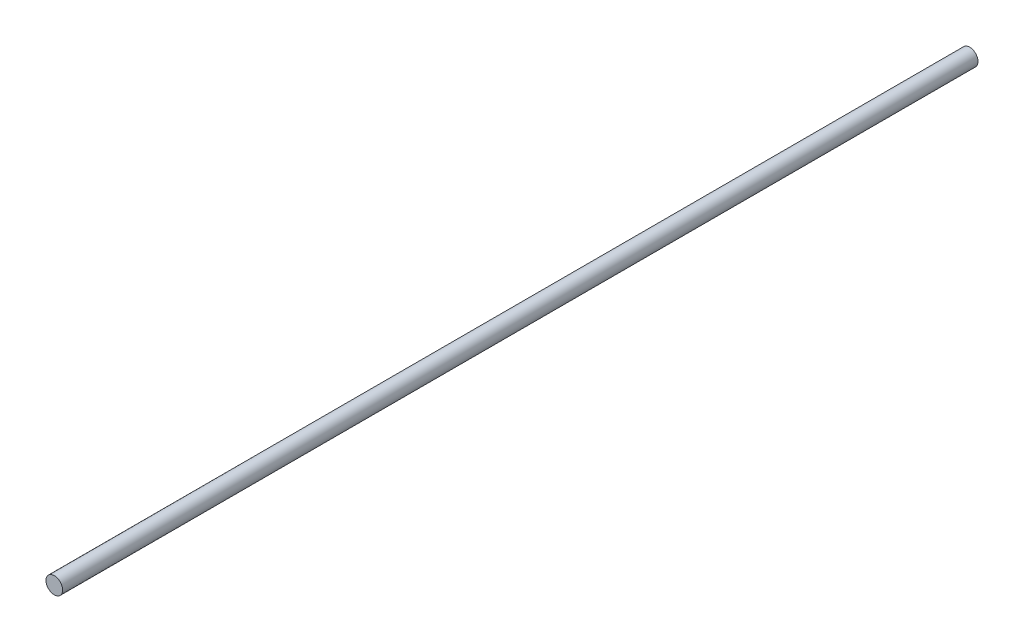
ISO-10303-21;
HEADER;
FILE_DESCRIPTION(('STEP AP214'),'2;1');
FILE_NAME('part.step','',(''),(''),'','','');
FILE_SCHEMA(('AUTOMOTIVE_DESIGN { 1 0 10303 214 1 1 1 1 }'));
ENDSEC;
DATA;
#1=APPLICATION_CONTEXT('core data for automotive mechanical design processes');
#2=APPLICATION_PROTOCOL_DEFINITION('international standard','automotive_design',2000,#1);
#3=PRODUCT_CONTEXT('',#1,'mechanical');
#4=PRODUCT('Part','Part','',(#3));
#5=PRODUCT_RELATED_PRODUCT_CATEGORY('part','',(#4));
#6=PRODUCT_DEFINITION_FORMATION('','',#4);
#7=PRODUCT_DEFINITION_CONTEXT('part definition',#1,'design');
#8=PRODUCT_DEFINITION('design','',#6,#7);
#9=PRODUCT_DEFINITION_SHAPE('','',#8);
#10=(LENGTH_UNIT() NAMED_UNIT(*) SI_UNIT(.MILLI.,.METRE.));
#11=(NAMED_UNIT(*) PLANE_ANGLE_UNIT() SI_UNIT($,.RADIAN.));
#12=(NAMED_UNIT(*) SI_UNIT($,.STERADIAN.) SOLID_ANGLE_UNIT());
#13=UNCERTAINTY_MEASURE_WITH_UNIT(LENGTH_MEASURE(1.E-05),#10,'distance_accuracy_value','');
#14=(GEOMETRIC_REPRESENTATION_CONTEXT(3) GLOBAL_UNCERTAINTY_ASSIGNED_CONTEXT((#13)) GLOBAL_UNIT_ASSIGNED_CONTEXT((#10,
#11,#12)) REPRESENTATION_CONTEXT('',''));
#15=CARTESIAN_POINT('',(0.,0.,0.));
#16=DIRECTION('',(0.,0.,1.));
#17=DIRECTION('',(1.,0.,0.));
#18=AXIS2_PLACEMENT_3D('',#15,#16,#17);
#19=CARTESIAN_POINT('',(0.,0.,880.));
#20=DIRECTION('',(0.,0.,-1.));
#21=DIRECTION('',(-1.,0.,0.));
#22=AXIS2_PLACEMENT_3D('',#19,#20,#21);
#23=CYLINDRICAL_SURFACE('',#22,8.);
#24=CARTESIAN_POINT('',(0.,0.,880.));
#25=DIRECTION('',(0.,0.,1.));
#26=DIRECTION('',(1.,0.,0.));
#27=AXIS2_PLACEMENT_3D('',#24,#25,#26);
#28=CIRCLE('',#27,8.);
#29=CARTESIAN_POINT('',(8.,0.,880.));
#30=VERTEX_POINT('',#29);
#31=EDGE_CURVE('E93',#30,#30,#28,.T.);
#32=ORIENTED_EDGE('',*,*,#31,.F.);
#33=EDGE_LOOP('',(#32));
#34=FACE_BOUND('',#33,.T.);
#35=CARTESIAN_POINT('',(0.,0.,0.));
#36=DIRECTION('',(0.,0.,1.));
#37=DIRECTION('',(1.,0.,0.));
#38=AXIS2_PLACEMENT_3D('',#35,#36,#37);
#39=CIRCLE('',#38,8.);
#40=CARTESIAN_POINT('',(8.,0.,0.));
#41=VERTEX_POINT('',#40);
#42=EDGE_CURVE('E94',#41,#41,#39,.T.);
#43=ORIENTED_EDGE('',*,*,#42,.T.);
#44=EDGE_LOOP('',(#43));
#45=FACE_BOUND('',#44,.T.);
#46=CARTESIAN_POINT('',(0.,-8.,97.9));
#47=CARTESIAN_POINT('',(0.115833511596032,-7.99999819195628,97.9000028841035));
#48=CARTESIAN_POINT('',(0.2316982501951,-7.99745940051544,97.909616018956));
#49=CARTESIAN_POINT('',(0.460094342166995,-7.98757807310896,97.9477491888625));
#50=CARTESIAN_POINT('',(0.57262398898168,-7.98023312073598,97.9762787346706));
#51=CARTESIAN_POINT('',(0.791019725256029,-7.96155083904336,98.0512565592851));
#52=CARTESIAN_POINT('',(0.896894059814115,-7.95021856917511,98.0976821371673));
#53=CARTESIAN_POINT('',(1.09935331899362,-7.92476163254481,98.2070511061223));
#54=CARTESIAN_POINT('',(1.19593770097294,-7.9106368028116,98.2699954612855));
#55=CARTESIAN_POINT('',(1.37925117233376,-7.88076611628938,98.4121124904898));
#56=CARTESIAN_POINT('',(1.4657411616673,-7.86499323150058,98.491587902084));
#57=CARTESIAN_POINT('',(1.62433067101484,-7.83377920697858,98.6638636153888));
#58=CARTESIAN_POINT('',(1.69642839863793,-7.81833810877902,98.7566655742965));
#59=CARTESIAN_POINT('',(1.82534201984977,-7.78926051431185,98.9548552889287));
#60=CARTESIAN_POINT('',(1.88188479269613,-7.77565817367775,99.0604261677836));
#61=CARTESIAN_POINT('',(1.97632500272312,-7.75219477487355,99.2799903974762));
#62=CARTESIAN_POINT('',(2.01422575983108,-7.7423330506146,99.3939822444749));
#63=CARTESIAN_POINT('',(2.06947944147047,-7.7277461952108,99.6245093400241));
#64=CARTESIAN_POINT('',(2.08726496052538,-7.72291310952526,99.7409339071786));
#65=CARTESIAN_POINT('',(2.10313167360473,-7.71860806057403,99.9752068838476));
#66=CARTESIAN_POINT('',(2.10121642629329,-7.71913512907228,100.093055032371));
#67=CARTESIAN_POINT('',(2.0780798464493,-7.72539410663991,100.323469123258));
#68=CARTESIAN_POINT('',(2.0573799110671,-7.73098544141679,100.436091843791));
#69=CARTESIAN_POINT('',(1.99809578012526,-7.74651813456766,100.656207070715));
#70=CARTESIAN_POINT('',(1.95951019476546,-7.7564598309821,100.763699177718));
#71=CARTESIAN_POINT('',(1.86512025732493,-7.77969805661573,100.97187090562));
#72=CARTESIAN_POINT('',(1.80913147739731,-7.7930302267118,101.072462756221));
#73=CARTESIAN_POINT('',(1.68165320895311,-7.82152779691157,101.263007705067));
#74=CARTESIAN_POINT('',(1.61016075495162,-7.8366935474898,101.352958762886));
#75=CARTESIAN_POINT('',(1.45102969385664,-7.86773635205478,101.522650029283));
#76=CARTESIAN_POINT('',(1.36295268682581,-7.88362074841378,101.601978339697));
#77=CARTESIAN_POINT('',(1.17455235148027,-7.9138812117581,101.744821352634));
#78=CARTESIAN_POINT('',(1.0742285698877,-7.92825722287841,101.808335469577));
#79=CARTESIAN_POINT('',(0.863557488892556,-7.9539650793444,101.917920747267));
#80=CARTESIAN_POINT('',(0.753170779424595,-7.96528420192041,101.963919324056));
#81=CARTESIAN_POINT('',(0.52586665924305,-7.98351083849399,102.03658854789));
#82=CARTESIAN_POINT('',(0.408950635574086,-7.99041928561896,102.063263283269));
#83=CARTESIAN_POINT('',(0.175423559502846,-7.99890583282364,102.095885420056));
#84=CARTESIAN_POINT('',(0.0588958853132472,-8.00062796836815,102.102393059625));
#85=CARTESIAN_POINT('',(-0.173585198681033,-7.99896097516747,102.096040739059));
#86=CARTESIAN_POINT('',(-0.289538664704997,-7.995572357143,102.083182714145));
#87=CARTESIAN_POINT('',(-0.515593754541121,-7.984157457251,102.038924190964));
#88=CARTESIAN_POINT('',(-0.625760501734723,-7.97620894030456,102.00783442566));
#89=CARTESIAN_POINT('',(-0.839305551591581,-7.95657428999088,101.928354271575));
#90=CARTESIAN_POINT('',(-0.942683129198787,-7.94488775819851,101.879962038505));
#91=CARTESIAN_POINT('',(-1.14190556423421,-7.91873395907708,101.766199606419));
#92=CARTESIAN_POINT('',(-1.23756848708351,-7.90421777265738,101.70052232588));
#93=CARTESIAN_POINT('',(-1.41671266217741,-7.87408351702661,101.554441818707));
#94=CARTESIAN_POINT('',(-1.5001915802279,-7.85846523752612,101.474035776996));
#95=CARTESIAN_POINT('',(-1.65494567981238,-7.82736002069367,101.298168872151));
#96=CARTESIAN_POINT('',(-1.72582613334943,-7.81188827100348,101.202357351983));
#97=CARTESIAN_POINT('',(-1.8505091432143,-7.78329771683265,100.999874695246));
#98=CARTESIAN_POINT('',(-1.90431242793833,-7.77017881200599,100.893204022109));
#99=CARTESIAN_POINT('',(-1.99290882876436,-7.74792888141172,100.672575981125));
#100=CARTESIAN_POINT('',(-2.02781305294318,-7.7387746125757,100.558665700038));
#101=CARTESIAN_POINT('',(-2.07789189088264,-7.72548052331326,100.326312784399));
#102=CARTESIAN_POINT('',(-2.09307135708221,-7.72133946961532,100.207871271948));
#103=CARTESIAN_POINT('',(-2.10299708758535,-7.71864141974656,99.973852831068));
#104=CARTESIAN_POINT('',(-2.09837684761733,-7.71991129232351,99.8583043589288));
#105=CARTESIAN_POINT('',(-2.07029878979463,-7.72748795420559,99.6296961976146));
#106=CARTESIAN_POINT('',(-2.04684142851754,-7.73379462142794,99.5166364481857));
#107=CARTESIAN_POINT('',(-1.98211695965678,-7.75063286395604,99.2969846342805));
#108=CARTESIAN_POINT('',(-1.94098015209595,-7.76113348993467,99.1903516360554));
#109=CARTESIAN_POINT('',(-1.84216607539681,-7.78517811860663,98.9854212336498));
#110=CARTESIAN_POINT('',(-1.78448628618962,-7.79872258491415,98.8871251024212));
#111=CARTESIAN_POINT('',(-1.6522867719803,-7.82781234314863,98.6986252324231));
#112=CARTESIAN_POINT('',(-1.5773328769132,-7.84340375519353,98.6087330626012));
#113=CARTESIAN_POINT('',(-1.41354374950194,-7.87456866492059,98.4425965579096));
#114=CARTESIAN_POINT('',(-1.3247051685619,-7.89014215736594,98.3663555248523));
#115=CARTESIAN_POINT('',(-1.1334670690893,-7.91989872252632,98.2281496584028));
#116=CARTESIAN_POINT('',(-1.03082655013164,-7.9340466781842,98.166510116505));
#117=CARTESIAN_POINT('',(-0.816273578266164,-7.95897761465417,98.0614584496492));
#118=CARTESIAN_POINT('',(-0.704367313251969,-7.96976281861927,98.0180342757192));
#119=CARTESIAN_POINT('',(-0.494016221616854,-7.98530690779944,97.9565111956749));
#120=CARTESIAN_POINT('',(-0.396503425400239,-7.99077726156327,97.9353678295777));
#121=CARTESIAN_POINT('',(-0.199334661752044,-7.99812441974496,97.9071116383897));
#122=CARTESIAN_POINT('',(-0.0996788930174474,-8.00000155588649,97.8999975181255));
#123=CARTESIAN_POINT('',(0.,-8.,97.9));
#124=B_SPLINE_CURVE_WITH_KNOTS('',3,(#46,#47,#48,#49,#50,#51,#52,#53,#54,#55,#56,#57,#58,#59,
#60,#61,#62,#63,#64,#65,#66,#67,#68,#69,#70,#71,#72,#73,#74,#75,#76,#77,#78,#79,#80,#81,#82,#83,
#84,#85,#86,#87,#88,#89,#90,#91,#92,#93,#94,#95,#96,#97,#98,#99,#100,#101,#102,#103,#104,#105,
#106,#107,#108,#109,#110,#111,#112,#113,#114,#115,#116,#117,#118,#119,#120,#121,#122,#123),
.UNSPECIFIED.,.T.,.F.,(4,2,2,2,2,2,2,2,2,2,2,2,2,2,2,2,2,2,2,2,2,2,2,2,2,2,2,2,2,2,2,2,2,2,2,2,
2,2,4),(0.,0.347135054104694,0.694444772537975,1.04131537442452,1.38820622533059,
1.74211971953539,2.09607726214146,2.45590198930199,2.81566261261907,3.16752972358662,
3.51933327586563,3.8616610312913,4.20401539167376,4.55012917269264,4.89630921554974,
5.25341577873974,5.61053556317449,5.96911954203014,6.32762763330046,6.6760828500082,
7.02450324768105,7.3671511676382,7.70983562170948,8.05907568618484,8.40838256999331,
8.76721198310333,9.12602608892656,9.48270715827049,9.83930046476419,10.1845711385303,
10.5298334438156,10.8725936173096,11.2154060328041,11.5680159891063,11.9207111166158,
12.2806484321439,12.6403472820153,12.9390970335523,13.2378192033626),.UNSPECIFIED.);
#125=CARTESIAN_POINT('',(0.,-8.,97.9));
#126=VERTEX_POINT('',#125);
#127=EDGE_CURVE('E88',#126,#126,#124,.T.);
#128=ORIENTED_EDGE('',*,*,#127,.F.);
#129=EDGE_LOOP('',(#128));
#130=FACE_BOUND('',#129,.T.);
#131=CARTESIAN_POINT('',(0.,-8.,247.9));
#132=CARTESIAN_POINT('',(0.115833511596035,-7.99999819195628,247.900002884103));
#133=CARTESIAN_POINT('',(0.231698250195107,-7.99745940051544,247.909616018956));
#134=CARTESIAN_POINT('',(0.460094342167,-7.98757807310896,247.947749188862));
#135=CARTESIAN_POINT('',(0.572623988981681,-7.98023312073598,247.976278734671));
#136=CARTESIAN_POINT('',(0.791019725256028,-7.96155083904337,248.051256559285));
#137=CARTESIAN_POINT('',(0.896894059814116,-7.95021856917511,248.097682137167));
#138=CARTESIAN_POINT('',(1.09935331899363,-7.92476163254481,248.207051106122));
#139=CARTESIAN_POINT('',(1.19593770097295,-7.9106368028116,248.269995461285));
#140=CARTESIAN_POINT('',(1.37925117233377,-7.88076611628938,248.41211249049));
#141=CARTESIAN_POINT('',(1.46574116166732,-7.86499323150058,248.491587902084));
#142=CARTESIAN_POINT('',(1.62433067101486,-7.83377920697858,248.663863615389));
#143=CARTESIAN_POINT('',(1.69642839863794,-7.81833810877902,248.756665574296));
#144=CARTESIAN_POINT('',(1.82534201984978,-7.78926051431185,248.954855288929));
#145=CARTESIAN_POINT('',(1.88188479269615,-7.77565817367774,249.060426167784));
#146=CARTESIAN_POINT('',(1.97632500272314,-7.75219477487355,249.279990397476));
#147=CARTESIAN_POINT('',(2.01422575983108,-7.7423330506146,249.393982244475));
#148=CARTESIAN_POINT('',(2.06947944147047,-7.7277461952108,249.624509340024));
#149=CARTESIAN_POINT('',(2.08726496052538,-7.72291310952526,249.740933907179));
#150=CARTESIAN_POINT('',(2.10313167360473,-7.71860806057403,249.975206883848));
#151=CARTESIAN_POINT('',(2.10121642629329,-7.71913512907228,250.093055032371));
#152=CARTESIAN_POINT('',(2.0780798464493,-7.7253941066399,250.323469123258));
#153=CARTESIAN_POINT('',(2.05737991106711,-7.73098544141679,250.436091843791));
#154=CARTESIAN_POINT('',(1.99809578012526,-7.74651813456766,250.656207070715));
#155=CARTESIAN_POINT('',(1.95951019476546,-7.7564598309821,250.763699177718));
#156=CARTESIAN_POINT('',(1.86512025732492,-7.77969805661573,250.97187090562));
#157=CARTESIAN_POINT('',(1.80913147739731,-7.7930302267118,251.072462756221));
#158=CARTESIAN_POINT('',(1.68165320895312,-7.82152779691157,251.263007705067));
#159=CARTESIAN_POINT('',(1.61016075495163,-7.8366935474898,251.352958762886));
#160=CARTESIAN_POINT('',(1.45102969385664,-7.86773635205478,251.522650029283));
#161=CARTESIAN_POINT('',(1.36295268682581,-7.88362074841378,251.601978339697));
#162=CARTESIAN_POINT('',(1.17455235148027,-7.9138812117581,251.744821352634));
#163=CARTESIAN_POINT('',(1.0742285698877,-7.92825722287841,251.808335469577));
#164=CARTESIAN_POINT('',(0.863557488892566,-7.9539650793444,251.917920747267));
#165=CARTESIAN_POINT('',(0.753170779424606,-7.96528420192041,251.963919324056));
#166=CARTESIAN_POINT('',(0.525866659243061,-7.98351083849399,252.03658854789));
#167=CARTESIAN_POINT('',(0.408950635574097,-7.99041928561896,252.063263283269));
#168=CARTESIAN_POINT('',(0.175423559502852,-7.99890583282365,252.095885420056));
#169=CARTESIAN_POINT('',(0.0588958853132488,-8.00062796836815,252.102393059625));
#170=CARTESIAN_POINT('',(-0.173585198681039,-7.99896097516747,252.096040739059));
#171=CARTESIAN_POINT('',(-0.289538664705006,-7.995572357143,252.083182714145));
#172=CARTESIAN_POINT('',(-0.515593754541134,-7.984157457251,252.038924190964));
#173=CARTESIAN_POINT('',(-0.625760501734737,-7.97620894030456,252.00783442566));
#174=CARTESIAN_POINT('',(-0.839305551591593,-7.95657428999088,251.928354271575));
#175=CARTESIAN_POINT('',(-0.942683129198795,-7.94488775819851,251.879962038505));
#176=CARTESIAN_POINT('',(-1.14190556423421,-7.91873395907708,251.766199606419));
#177=CARTESIAN_POINT('',(-1.23756848708351,-7.90421777265738,251.70052232588));
#178=CARTESIAN_POINT('',(-1.41671266217742,-7.87408351702661,251.554441818707));
#179=CARTESIAN_POINT('',(-1.50019158022791,-7.85846523752612,251.474035776996));
#180=CARTESIAN_POINT('',(-1.65494567981239,-7.82736002069367,251.29816887215));
#181=CARTESIAN_POINT('',(-1.72582613334945,-7.81188827100348,251.202357351983));
#182=CARTESIAN_POINT('',(-1.85050914321431,-7.78329771683265,250.999874695245));
#183=CARTESIAN_POINT('',(-1.90431242793834,-7.77017881200599,250.893204022109));
#184=CARTESIAN_POINT('',(-1.99290882876436,-7.74792888141172,250.672575981125));
#185=CARTESIAN_POINT('',(-2.02781305294319,-7.7387746125757,250.558665700038));
#186=CARTESIAN_POINT('',(-2.07789189088264,-7.72548052331326,250.326312784399));
#187=CARTESIAN_POINT('',(-2.09307135708221,-7.72133946961532,250.207871271948));
#188=CARTESIAN_POINT('',(-2.10299708758536,-7.71864141974656,249.973852831068));
#189=CARTESIAN_POINT('',(-2.09837684761733,-7.71991129232351,249.858304358929));
#190=CARTESIAN_POINT('',(-2.07029878979463,-7.72748795420559,249.629696197615));
#191=CARTESIAN_POINT('',(-2.04684142851754,-7.73379462142794,249.516636448186));
#192=CARTESIAN_POINT('',(-1.98211695965678,-7.75063286395604,249.29698463428));
#193=CARTESIAN_POINT('',(-1.94098015209595,-7.76113348993467,249.190351636055));
#194=CARTESIAN_POINT('',(-1.84216607539681,-7.78517811860663,248.98542123365));
#195=CARTESIAN_POINT('',(-1.78448628618962,-7.79872258491415,248.887125102421));
#196=CARTESIAN_POINT('',(-1.65228677198029,-7.82781234314864,248.698625232423));
#197=CARTESIAN_POINT('',(-1.5773328769132,-7.84340375519354,248.608733062601));
#198=CARTESIAN_POINT('',(-1.41354374950194,-7.87456866492059,248.44259655791));
#199=CARTESIAN_POINT('',(-1.32470516856189,-7.89014215736594,248.366355524852));
#200=CARTESIAN_POINT('',(-1.1334670690893,-7.91989872252632,248.228149658403));
#201=CARTESIAN_POINT('',(-1.03082655013163,-7.9340466781842,248.166510116505));
#202=CARTESIAN_POINT('',(-0.816273578266159,-7.95897761465417,248.061458449649));
#203=CARTESIAN_POINT('',(-0.704367313251965,-7.96976281861928,248.018034275719));
#204=CARTESIAN_POINT('',(-0.49401622161685,-7.98530690779944,247.956511195675));
#205=CARTESIAN_POINT('',(-0.396503425400236,-7.99077726156327,247.935367829578));
#206=CARTESIAN_POINT('',(-0.199334661752043,-7.99812441974496,247.90711163839));
#207=CARTESIAN_POINT('',(-0.0996788930174473,-8.00000155588649,247.899997518126));
#208=CARTESIAN_POINT('',(0.,-8.,247.9));
#209=B_SPLINE_CURVE_WITH_KNOTS('',3,(#131,#132,#133,#134,#135,#136,#137,#138,#139,#140,#141,
#142,#143,#144,#145,#146,#147,#148,#149,#150,#151,#152,#153,#154,#155,#156,#157,#158,#159,#160,
#161,#162,#163,#164,#165,#166,#167,#168,#169,#170,#171,#172,#173,#174,#175,#176,#177,#178,#179,
#180,#181,#182,#183,#184,#185,#186,#187,#188,#189,#190,#191,#192,#193,#194,#195,#196,#197,#198,
#199,#200,#201,#202,#203,#204,#205,#206,#207,#208),.UNSPECIFIED.,.T.,.F.,(4,2,2,2,2,2,2,2,2,2,2,
2,2,2,2,2,2,2,2,2,2,2,2,2,2,2,2,2,2,2,2,2,2,2,2,2,2,2,4),(0.,0.347135054104699,0.69444477253798,
1.04131537442452,1.3882062253306,1.74211971953544,2.09607726214147,2.45590198930203,
2.8156626126191,3.16752972358666,3.51933327586562,3.86166103129128,4.20401539167375,
4.55012917269262,4.89630921554975,5.25341577873973,5.61053556317448,5.96911954203011,
6.32762763330045,6.6760828500082,7.02450324768106,7.36715116763822,7.70983562170949,
8.05907568618482,8.40838256999333,8.76721198310337,9.12602608892654,9.48270715827051,
9.83930046476413,10.1845711385303,10.5298334438156,10.8725936173096,11.215406032804,
11.5680159891063,11.9207111166158,12.2806484321438,12.6403472820153,12.9390970335523,
13.2378192033625),.UNSPECIFIED.);
#210=CARTESIAN_POINT('',(0.,-8.,247.9));
#211=VERTEX_POINT('',#210);
#212=EDGE_CURVE('E49',#211,#211,#209,.T.);
#213=ORIENTED_EDGE('',*,*,#212,.F.);
#214=EDGE_LOOP('',(#213));
#215=FACE_BOUND('',#214,.T.);
#216=CARTESIAN_POINT('',(0.,-8.,397.9));
#217=CARTESIAN_POINT('',(0.115833511596036,-7.99999819195628,397.900002884104));
#218=CARTESIAN_POINT('',(0.231698250195109,-7.99745940051544,397.909616018956));
#219=CARTESIAN_POINT('',(0.460094342167005,-7.98757807310896,397.947749188862));
#220=CARTESIAN_POINT('',(0.572623988981687,-7.98023312073597,397.976278734671));
#221=CARTESIAN_POINT('',(0.79101972525605,-7.96155083904336,398.051256559285));
#222=CARTESIAN_POINT('',(0.896894059814151,-7.95021856917511,398.097682137167));
#223=CARTESIAN_POINT('',(1.09935331899366,-7.92476163254481,398.207051106122));
#224=CARTESIAN_POINT('',(1.19593770097296,-7.9106368028116,398.269995461286));
#225=CARTESIAN_POINT('',(1.37925117233376,-7.88076611628938,398.41211249049));
#226=CARTESIAN_POINT('',(1.4657411616673,-7.86499323150058,398.491587902084));
#227=CARTESIAN_POINT('',(1.62433067101485,-7.83377920697858,398.663863615389));
#228=CARTESIAN_POINT('',(1.69642839863793,-7.81833810877902,398.756665574297));
#229=CARTESIAN_POINT('',(1.82534201984977,-7.78926051431185,398.954855288929));
#230=CARTESIAN_POINT('',(1.88188479269614,-7.77565817367774,399.060426167784));
#231=CARTESIAN_POINT('',(1.97632500272313,-7.75219477487355,399.279990397476));
#232=CARTESIAN_POINT('',(2.01422575983108,-7.7423330506146,399.393982244475));
#233=CARTESIAN_POINT('',(2.06947944147047,-7.7277461952108,399.624509340024));
#234=CARTESIAN_POINT('',(2.08726496052538,-7.72291310952526,399.740933907179));
#235=CARTESIAN_POINT('',(2.10313167360473,-7.71860806057403,399.975206883848));
#236=CARTESIAN_POINT('',(2.10121642629329,-7.71913512907228,400.093055032371));
#237=CARTESIAN_POINT('',(2.0780798464493,-7.7253941066399,400.323469123258));
#238=CARTESIAN_POINT('',(2.05737991106711,-7.73098544141679,400.436091843791));
#239=CARTESIAN_POINT('',(1.99809578012527,-7.74651813456766,400.656207070715));
#240=CARTESIAN_POINT('',(1.95951019476546,-7.7564598309821,400.763699177718));
#241=CARTESIAN_POINT('',(1.86512025732492,-7.77969805661573,400.97187090562));
#242=CARTESIAN_POINT('',(1.80913147739731,-7.7930302267118,401.072462756221));
#243=CARTESIAN_POINT('',(1.68165320895312,-7.82152779691157,401.263007705067));
#244=CARTESIAN_POINT('',(1.61016075495163,-7.8366935474898,401.352958762886));
#245=CARTESIAN_POINT('',(1.45102969385664,-7.86773635205479,401.522650029283));
#246=CARTESIAN_POINT('',(1.36295268682581,-7.88362074841378,401.601978339697));
#247=CARTESIAN_POINT('',(1.17455235148026,-7.91388121175811,401.744821352634));
#248=CARTESIAN_POINT('',(1.07422856988768,-7.92825722287841,401.808335469577));
#249=CARTESIAN_POINT('',(0.863557488892538,-7.95396507934441,401.917920747267));
#250=CARTESIAN_POINT('',(0.753170779424575,-7.96528420192041,401.963919324056));
#251=CARTESIAN_POINT('',(0.525866659243036,-7.98351083849399,402.03658854789));
#252=CARTESIAN_POINT('',(0.40895063557408,-7.99041928561896,402.063263283269));
#253=CARTESIAN_POINT('',(0.175423559502844,-7.99890583282365,402.095885420056));
#254=CARTESIAN_POINT('',(0.0588958853132427,-8.00062796836815,402.102393059625));
#255=CARTESIAN_POINT('',(-0.173585198681039,-7.99896097516747,402.096040739059));
#256=CARTESIAN_POINT('',(-0.289538664705001,-7.995572357143,402.083182714145));
#257=CARTESIAN_POINT('',(-0.515593754541125,-7.984157457251,402.038924190964));
#258=CARTESIAN_POINT('',(-0.625760501734728,-7.97620894030456,402.00783442566));
#259=CARTESIAN_POINT('',(-0.839305551591587,-7.95657428999088,401.928354271575));
#260=CARTESIAN_POINT('',(-0.942683129198791,-7.94488775819851,401.879962038505));
#261=CARTESIAN_POINT('',(-1.14190556423421,-7.91873395907708,401.766199606419));
#262=CARTESIAN_POINT('',(-1.23756848708351,-7.90421777265738,401.70052232588));
#263=CARTESIAN_POINT('',(-1.41671266217742,-7.87408351702661,401.554441818707));
#264=CARTESIAN_POINT('',(-1.50019158022791,-7.85846523752612,401.474035776996));
#265=CARTESIAN_POINT('',(-1.65494567981239,-7.82736002069367,401.29816887215));
#266=CARTESIAN_POINT('',(-1.72582613334945,-7.81188827100348,401.202357351983));
#267=CARTESIAN_POINT('',(-1.85050914321432,-7.78329771683265,400.999874695246));
#268=CARTESIAN_POINT('',(-1.90431242793834,-7.77017881200599,400.893204022109));
#269=CARTESIAN_POINT('',(-1.99290882876436,-7.74792888141172,400.672575981125));
#270=CARTESIAN_POINT('',(-2.02781305294319,-7.7387746125757,400.558665700038));
#271=CARTESIAN_POINT('',(-2.07789189088264,-7.72548052331326,400.326312784399));
#272=CARTESIAN_POINT('',(-2.09307135708221,-7.72133946961532,400.207871271948));
#273=CARTESIAN_POINT('',(-2.10299708758536,-7.71864141974656,399.973852831068));
#274=CARTESIAN_POINT('',(-2.09837684761733,-7.71991129232351,399.858304358929));
#275=CARTESIAN_POINT('',(-2.07029878979463,-7.72748795420559,399.629696197615));
#276=CARTESIAN_POINT('',(-2.04684142851755,-7.73379462142794,399.516636448186));
#277=CARTESIAN_POINT('',(-1.98211695965677,-7.75063286395605,399.296984634281));
#278=CARTESIAN_POINT('',(-1.94098015209593,-7.76113348993467,399.190351636055));
#279=CARTESIAN_POINT('',(-1.8421660753968,-7.78517811860663,398.98542123365));
#280=CARTESIAN_POINT('',(-1.78448628618961,-7.79872258491415,398.887125102421));
#281=CARTESIAN_POINT('',(-1.65228677198029,-7.82781234314864,398.698625232423));
#282=CARTESIAN_POINT('',(-1.5773328769132,-7.84340375519354,398.608733062601));
#283=CARTESIAN_POINT('',(-1.41354374950195,-7.87456866492059,398.44259655791));
#284=CARTESIAN_POINT('',(-1.3247051685619,-7.89014215736594,398.366355524852));
#285=CARTESIAN_POINT('',(-1.13346706908932,-7.91989872252632,398.228149658403));
#286=CARTESIAN_POINT('',(-1.03082655013165,-7.9340466781842,398.166510116505));
#287=CARTESIAN_POINT('',(-0.816273578266165,-7.95897761465417,398.061458449649));
#288=CARTESIAN_POINT('',(-0.704367313251961,-7.96976281861928,398.018034275719));
#289=CARTESIAN_POINT('',(-0.494016221616839,-7.98530690779944,397.956511195675));
#290=CARTESIAN_POINT('',(-0.396503425400229,-7.99077726156327,397.935367829578));
#291=CARTESIAN_POINT('',(-0.19933466175204,-7.99812441974496,397.90711163839));
#292=CARTESIAN_POINT('',(-0.0996788930174455,-8.0000015558865,397.899997518126));
#293=CARTESIAN_POINT('',(0.,-8.,397.9));
#294=B_SPLINE_CURVE_WITH_KNOTS('',3,(#216,#217,#218,#219,#220,#221,#222,#223,#224,#225,#226,
#227,#228,#229,#230,#231,#232,#233,#234,#235,#236,#237,#238,#239,#240,#241,#242,#243,#244,#245,
#246,#247,#248,#249,#250,#251,#252,#253,#254,#255,#256,#257,#258,#259,#260,#261,#262,#263,#264,
#265,#266,#267,#268,#269,#270,#271,#272,#273,#274,#275,#276,#277,#278,#279,#280,#281,#282,#283,
#284,#285,#286,#287,#288,#289,#290,#291,#292,#293),.UNSPECIFIED.,.T.,.F.,(4,2,2,2,2,2,2,2,2,2,2,
2,2,2,2,2,2,2,2,2,2,2,2,2,2,2,2,2,2,2,2,2,2,2,2,2,2,2,4),(0.,0.347135054104704,0.69444477253798,
1.04131537442456,1.38820622533063,1.74211971953541,2.09607726214148,2.45590198930198,
2.81566261261908,3.16752972358667,3.51933327586563,3.86166103129129,4.20401539167375,
4.55012917269263,4.89630921554976,5.25341577873975,5.6105355631745,5.96911954203015,
6.32762763330046,6.67608285000821,7.02450324768106,7.36715116763818,7.70983562170951,
8.05907568618483,8.40838256999334,8.76721198310338,9.12602608892655,9.48270715827052,
9.83930046476414,10.1845711385303,10.5298334438156,10.8725936173096,11.2154060328041,
11.5680159891063,11.9207111166158,12.2806484321438,12.6403472820153,12.9390970335523,
13.2378192033625),.UNSPECIFIED.);
#295=CARTESIAN_POINT('',(0.,-8.,397.9));
#296=VERTEX_POINT('',#295);
#297=EDGE_CURVE('E45',#296,#296,#294,.T.);
#298=ORIENTED_EDGE('',*,*,#297,.F.);
#299=EDGE_LOOP('',(#298));
#300=FACE_BOUND('',#299,.T.);
#301=CARTESIAN_POINT('',(0.,-8.,547.9));
#302=CARTESIAN_POINT('',(0.115833511596029,-7.99999819195628,547.900002884103));
#303=CARTESIAN_POINT('',(0.231698250195087,-7.99745940051544,547.909616018956));
#304=CARTESIAN_POINT('',(0.460094342166978,-7.98757807310896,547.947749188862));
#305=CARTESIAN_POINT('',(0.57262398898167,-7.98023312073598,547.976278734671));
#306=CARTESIAN_POINT('',(0.791019725256016,-7.96155083904337,548.051256559285));
#307=CARTESIAN_POINT('',(0.896894059814092,-7.95021856917512,548.097682137167));
#308=CARTESIAN_POINT('',(1.09935331899359,-7.92476163254482,548.207051106122));
#309=CARTESIAN_POINT('',(1.19593770097292,-7.9106368028116,548.269995461285));
#310=CARTESIAN_POINT('',(1.37925117233373,-7.88076611628939,548.41211249049));
#311=CARTESIAN_POINT('',(1.46574116166726,-7.86499323150059,548.491587902084));
#312=CARTESIAN_POINT('',(1.6243306710148,-7.83377920697859,548.663863615389));
#313=CARTESIAN_POINT('',(1.6964283986379,-7.81833810877903,548.756665574296));
#314=CARTESIAN_POINT('',(1.82534201984976,-7.78926051431185,548.954855288929));
#315=CARTESIAN_POINT('',(1.88188479269613,-7.77565817367775,549.060426167783));
#316=CARTESIAN_POINT('',(1.97632500272313,-7.75219477487355,549.279990397476));
#317=CARTESIAN_POINT('',(2.01422575983108,-7.7423330506146,549.393982244475));
#318=CARTESIAN_POINT('',(2.06947944147047,-7.7277461952108,549.624509340024));
#319=CARTESIAN_POINT('',(2.08726496052538,-7.72291310952526,549.740933907178));
#320=CARTESIAN_POINT('',(2.10313167360473,-7.71860806057402,549.975206883847));
#321=CARTESIAN_POINT('',(2.1012164262933,-7.71913512907228,550.093055032371));
#322=CARTESIAN_POINT('',(2.0780798464493,-7.7253941066399,550.323469123258));
#323=CARTESIAN_POINT('',(2.0573799110671,-7.73098544141679,550.43609184379));
#324=CARTESIAN_POINT('',(1.99809578012527,-7.74651813456766,550.656207070715));
#325=CARTESIAN_POINT('',(1.95951019476548,-7.7564598309821,550.763699177718));
#326=CARTESIAN_POINT('',(1.86512025732496,-7.77969805661573,550.97187090562));
#327=CARTESIAN_POINT('',(1.80913147739735,-7.79303022671179,551.072462756221));
#328=CARTESIAN_POINT('',(1.68165320895317,-7.82152779691156,551.263007705067));
#329=CARTESIAN_POINT('',(1.61016075495168,-7.83669354748979,551.352958762886));
#330=CARTESIAN_POINT('',(1.45102969385667,-7.86773635205478,551.522650029283));
#331=CARTESIAN_POINT('',(1.36295268682583,-7.88362074841377,551.601978339697));
#332=CARTESIAN_POINT('',(1.17455235148028,-7.9138812117581,551.744821352634));
#333=CARTESIAN_POINT('',(1.07422856988773,-7.92825722287841,551.808335469577));
#334=CARTESIAN_POINT('',(0.863557488892608,-7.9539650793444,551.917920747267));
#335=CARTESIAN_POINT('',(0.753170779424644,-7.9652842019204,551.963919324056));
#336=CARTESIAN_POINT('',(0.525866659243104,-7.98351083849398,552.03658854789));
#337=CARTESIAN_POINT('',(0.408950635574151,-7.99041928561896,552.063263283269));
#338=CARTESIAN_POINT('',(0.17542355950291,-7.99890583282365,552.095885420056));
#339=CARTESIAN_POINT('',(0.0588958853133,-8.00062796836815,552.102393059625));
#340=CARTESIAN_POINT('',(-0.173585198681003,-7.99896097516747,552.096040739059));
#341=CARTESIAN_POINT('',(-0.289538664704977,-7.995572357143,552.083182714145));
#342=CARTESIAN_POINT('',(-0.515593754541123,-7.984157457251,552.038924190964));
#343=CARTESIAN_POINT('',(-0.625760501734735,-7.97620894030456,552.00783442566));
#344=CARTESIAN_POINT('',(-0.839305551591585,-7.95657428999088,551.928354271575));
#345=CARTESIAN_POINT('',(-0.942683129198772,-7.94488775819851,551.879962038505));
#346=CARTESIAN_POINT('',(-1.14190556423418,-7.91873395907709,551.766199606419));
#347=CARTESIAN_POINT('',(-1.2375684870835,-7.90421777265738,551.70052232588));
#348=CARTESIAN_POINT('',(-1.41671266217741,-7.87408351702661,551.554441818707));
#349=CARTESIAN_POINT('',(-1.50019158022789,-7.85846523752612,551.474035776996));
#350=CARTESIAN_POINT('',(-1.65494567981237,-7.82736002069367,551.29816887215));
#351=CARTESIAN_POINT('',(-1.72582613334944,-7.81188827100348,551.202357351983));
#352=CARTESIAN_POINT('',(-1.85050914321432,-7.78329771683265,550.999874695245));
#353=CARTESIAN_POINT('',(-1.90431242793834,-7.77017881200599,550.893204022109));
#354=CARTESIAN_POINT('',(-1.99290882876437,-7.74792888141172,550.672575981125));
#355=CARTESIAN_POINT('',(-2.02781305294321,-7.7387746125757,550.558665700038));
#356=CARTESIAN_POINT('',(-2.07789189088267,-7.72548052331326,550.326312784399));
#357=CARTESIAN_POINT('',(-2.09307135708222,-7.72133946961532,550.207871271948));
#358=CARTESIAN_POINT('',(-2.10299708758535,-7.71864141974656,549.973852831068));
#359=CARTESIAN_POINT('',(-2.09837684761733,-7.71991129232351,549.858304358929));
#360=CARTESIAN_POINT('',(-2.07029878979464,-7.72748795420559,549.629696197615));
#361=CARTESIAN_POINT('',(-2.04684142851755,-7.73379462142794,549.516636448186));
#362=CARTESIAN_POINT('',(-1.98211695965681,-7.75063286395604,549.296984634281));
#363=CARTESIAN_POINT('',(-1.94098015209598,-7.76113348993466,549.190351636055));
#364=CARTESIAN_POINT('',(-1.84216607539684,-7.78517811860662,548.98542123365));
#365=CARTESIAN_POINT('',(-1.78448628618962,-7.79872258491415,548.887125102421));
#366=CARTESIAN_POINT('',(-1.6522867719803,-7.82781234314864,548.698625232423));
#367=CARTESIAN_POINT('',(-1.57733287691324,-7.84340375519353,548.608733062601));
#368=CARTESIAN_POINT('',(-1.41354374950204,-7.87456866492057,548.44259655791));
#369=CARTESIAN_POINT('',(-1.32470516856198,-7.89014215736593,548.366355524852));
#370=CARTESIAN_POINT('',(-1.13346706908938,-7.91989872252631,548.228149658403));
#371=CARTESIAN_POINT('',(-1.03082655013171,-7.93404667818419,548.166510116505));
#372=CARTESIAN_POINT('',(-0.816273578266212,-7.95897761465417,548.061458449649));
#373=CARTESIAN_POINT('',(-0.704367313252002,-7.96976281861927,548.018034275719));
#374=CARTESIAN_POINT('',(-0.494016221616876,-7.98530690779944,547.956511195675));
#375=CARTESIAN_POINT('',(-0.396503425400265,-7.99077726156327,547.935367829578));
#376=CARTESIAN_POINT('',(-0.199334661752062,-7.99812441974496,547.90711163839));
#377=CARTESIAN_POINT('',(-0.0996788930174541,-8.00000155588649,547.899997518125));
#378=CARTESIAN_POINT('',(0.,-8.,547.9));
#379=B_SPLINE_CURVE_WITH_KNOTS('',3,(#301,#302,#303,#304,#305,#306,#307,#308,#309,#310,#311,
#312,#313,#314,#315,#316,#317,#318,#319,#320,#321,#322,#323,#324,#325,#326,#327,#328,#329,#330,
#331,#332,#333,#334,#335,#336,#337,#338,#339,#340,#341,#342,#343,#344,#345,#346,#347,#348,#349,
#350,#351,#352,#353,#354,#355,#356,#357,#358,#359,#360,#361,#362,#363,#364,#365,#366,#367,#368,
#369,#370,#371,#372,#373,#374,#375,#376,#377,#378),.UNSPECIFIED.,.T.,.F.,(4,2,2,2,2,2,2,2,2,2,2,
2,2,2,2,2,2,2,2,2,2,2,2,2,2,2,2,2,2,2,2,2,2,2,2,2,2,2,4),(0.,0.34713505410468,0.694444772537957,
1.04131537442446,1.38820622533052,1.74211971953534,2.09607726214142,2.45590198930203,
2.81566261261913,3.16752972358661,3.51933327586563,3.86166103129129,4.20401539167375,
4.5501291726925,4.89630921554969,5.25341577873979,5.61053556317441,5.9691195420301,
6.32762763330039,6.67608285000817,7.02450324768106,7.36715116763821,7.70983562170946,
8.0590756861848,8.40838256999335,8.7672119831034,9.12602608892657,9.4827071582706,
9.83930046476432,10.1845711385304,10.5298334438155,10.8725936173095,11.2154060328041,
11.5680159891061,11.9207111166157,12.2806484321438,12.6403472820153,12.9390970335523,
13.2378192033626),.UNSPECIFIED.);
#380=CARTESIAN_POINT('',(0.,-8.,547.9));
#381=VERTEX_POINT('',#380);
#382=EDGE_CURVE('E41',#381,#381,#379,.T.);
#383=ORIENTED_EDGE('',*,*,#382,.F.);
#384=EDGE_LOOP('',(#383));
#385=FACE_BOUND('',#384,.T.);
#386=CARTESIAN_POINT('',(0.,-8.,697.9));
#387=CARTESIAN_POINT('',(0.115833511596035,-7.99999819195628,697.900002884104));
#388=CARTESIAN_POINT('',(0.231698250195099,-7.99745940051544,697.909616018956));
#389=CARTESIAN_POINT('',(0.46009434216699,-7.98757807310896,697.947749188863));
#390=CARTESIAN_POINT('',(0.572623988981676,-7.98023312073598,697.976278734671));
#391=CARTESIAN_POINT('',(0.791019725256015,-7.96155083904337,698.051256559285));
#392=CARTESIAN_POINT('',(0.896894059814091,-7.95021856917512,698.097682137167));
#393=CARTESIAN_POINT('',(1.0993533189936,-7.92476163254482,698.207051106122));
#394=CARTESIAN_POINT('',(1.19593770097292,-7.9106368028116,698.269995461285));
#395=CARTESIAN_POINT('',(1.37925117233375,-7.88076611628938,698.41211249049));
#396=CARTESIAN_POINT('',(1.46574116166729,-7.86499323150058,698.491587902084));
#397=CARTESIAN_POINT('',(1.62433067101482,-7.83377920697859,698.663863615389));
#398=CARTESIAN_POINT('',(1.69642839863791,-7.81833810877902,698.756665574296));
#399=CARTESIAN_POINT('',(1.82534201984977,-7.78926051431185,698.954855288929));
#400=CARTESIAN_POINT('',(1.88188479269613,-7.77565817367775,699.060426167783));
#401=CARTESIAN_POINT('',(1.97632500272312,-7.75219477487355,699.279990397476));
#402=CARTESIAN_POINT('',(2.01422575983108,-7.7423330506146,699.393982244475));
#403=CARTESIAN_POINT('',(2.06947944147048,-7.7277461952108,699.624509340024));
#404=CARTESIAN_POINT('',(2.08726496052539,-7.72291310952526,699.740933907179));
#405=CARTESIAN_POINT('',(2.10313167360473,-7.71860806057403,699.975206883848));
#406=CARTESIAN_POINT('',(2.10121642629329,-7.71913512907228,700.093055032371));
#407=CARTESIAN_POINT('',(2.0780798464493,-7.7253941066399,700.323469123258));
#408=CARTESIAN_POINT('',(2.05737991106712,-7.73098544141679,700.43609184379));
#409=CARTESIAN_POINT('',(1.9980957801253,-7.74651813456766,700.656207070715));
#410=CARTESIAN_POINT('',(1.95951019476549,-7.75645983098209,700.763699177718));
#411=CARTESIAN_POINT('',(1.86512025732495,-7.77969805661573,700.97187090562));
#412=CARTESIAN_POINT('',(1.80913147739733,-7.7930302267118,701.072462756221));
#413=CARTESIAN_POINT('',(1.68165320895314,-7.82152779691156,701.263007705067));
#414=CARTESIAN_POINT('',(1.61016075495166,-7.83669354748979,701.352958762886));
#415=CARTESIAN_POINT('',(1.45102969385668,-7.86773635205477,701.522650029283));
#416=CARTESIAN_POINT('',(1.36295268682585,-7.88362074841377,701.601978339697));
#417=CARTESIAN_POINT('',(1.17455235148031,-7.9138812117581,701.744821352633));
#418=CARTESIAN_POINT('',(1.07422856988775,-7.9282572228784,701.808335469577));
#419=CARTESIAN_POINT('',(0.863557488892626,-7.9539650793444,701.917920747267));
#420=CARTESIAN_POINT('',(0.753170779424668,-7.9652842019204,701.963919324056));
#421=CARTESIAN_POINT('',(0.525866659243125,-7.98351083849398,702.03658854789));
#422=CARTESIAN_POINT('',(0.408950635574162,-7.99041928561896,702.063263283269));
#423=CARTESIAN_POINT('',(0.175423559502909,-7.99890583282365,702.095885420056));
#424=CARTESIAN_POINT('',(0.0588958853132982,-8.00062796836815,702.102393059625));
#425=CARTESIAN_POINT('',(-0.173585198681005,-7.99896097516747,702.096040739059));
#426=CARTESIAN_POINT('',(-0.289538664704979,-7.995572357143,702.083182714145));
#427=CARTESIAN_POINT('',(-0.51559375454111,-7.984157457251,702.038924190964));
#428=CARTESIAN_POINT('',(-0.625760501734709,-7.97620894030456,702.00783442566));
#429=CARTESIAN_POINT('',(-0.83930555159156,-7.95657428999088,701.928354271575));
#430=CARTESIAN_POINT('',(-0.942683129198761,-7.94488775819851,701.879962038505));
#431=CARTESIAN_POINT('',(-1.14190556423419,-7.91873395907709,701.766199606419));
#432=CARTESIAN_POINT('',(-1.2375684870835,-7.90421777265738,701.70052232588));
#433=CARTESIAN_POINT('',(-1.41671266217741,-7.87408351702661,701.554441818707));
#434=CARTESIAN_POINT('',(-1.50019158022789,-7.85846523752612,701.474035776996));
#435=CARTESIAN_POINT('',(-1.65494567981237,-7.82736002069367,701.29816887215));
#436=CARTESIAN_POINT('',(-1.72582613334944,-7.81188827100348,701.202357351983));
#437=CARTESIAN_POINT('',(-1.85050914321432,-7.78329771683265,700.999874695245));
#438=CARTESIAN_POINT('',(-1.90431242793834,-7.77017881200599,700.893204022109));
#439=CARTESIAN_POINT('',(-1.99290882876436,-7.74792888141172,700.672575981125));
#440=CARTESIAN_POINT('',(-2.02781305294319,-7.7387746125757,700.558665700038));
#441=CARTESIAN_POINT('',(-2.07789189088266,-7.72548052331326,700.326312784399));
#442=CARTESIAN_POINT('',(-2.09307135708222,-7.72133946961532,700.207871271948));
#443=CARTESIAN_POINT('',(-2.10299708758535,-7.71864141974656,699.973852831068));
#444=CARTESIAN_POINT('',(-2.09837684761733,-7.71991129232351,699.858304358929));
#445=CARTESIAN_POINT('',(-2.07029878979464,-7.72748795420559,699.629696197615));
#446=CARTESIAN_POINT('',(-2.04684142851755,-7.73379462142794,699.516636448186));
#447=CARTESIAN_POINT('',(-1.98211695965681,-7.75063286395604,699.296984634281));
#448=CARTESIAN_POINT('',(-1.94098015209598,-7.76113348993466,699.190351636055));
#449=CARTESIAN_POINT('',(-1.84216607539683,-7.78517811860662,698.98542123365));
#450=CARTESIAN_POINT('',(-1.78448628618961,-7.79872258491415,698.887125102421));
#451=CARTESIAN_POINT('',(-1.65228677198029,-7.82781234314864,698.698625232423));
#452=CARTESIAN_POINT('',(-1.57733287691322,-7.84340375519353,698.608733062601));
#453=CARTESIAN_POINT('',(-1.413543749502,-7.87456866492058,698.44259655791));
#454=CARTESIAN_POINT('',(-1.32470516856196,-7.89014215736593,698.366355524852));
#455=CARTESIAN_POINT('',(-1.13346706908936,-7.91989872252631,698.228149658403));
#456=CARTESIAN_POINT('',(-1.03082655013167,-7.93404667818419,698.166510116505));
#457=CARTESIAN_POINT('',(-0.816273578266182,-7.95897761465417,698.061458449649));
#458=CARTESIAN_POINT('',(-0.704367313251987,-7.96976281861927,698.018034275719));
#459=CARTESIAN_POINT('',(-0.494016221616877,-7.98530690779944,697.956511195675));
#460=CARTESIAN_POINT('',(-0.396503425400265,-7.99077726156327,697.935367829578));
#461=CARTESIAN_POINT('',(-0.199334661752062,-7.99812441974496,697.90711163839));
#462=CARTESIAN_POINT('',(-0.0996788930174541,-8.00000155588649,697.899997518125));
#463=CARTESIAN_POINT('',(0.,-8.,697.9));
#464=B_SPLINE_CURVE_WITH_KNOTS('',3,(#386,#387,#388,#389,#390,#391,#392,#393,#394,#395,#396,
#397,#398,#399,#400,#401,#402,#403,#404,#405,#406,#407,#408,#409,#410,#411,#412,#413,#414,#415,
#416,#417,#418,#419,#420,#421,#422,#423,#424,#425,#426,#427,#428,#429,#430,#431,#432,#433,#434,
#435,#436,#437,#438,#439,#440,#441,#442,#443,#444,#445,#446,#447,#448,#449,#450,#451,#452,#453,
#454,#455,#456,#457,#458,#459,#460,#461,#462,#463),.UNSPECIFIED.,.T.,.F.,(4,2,2,2,2,2,2,2,2,2,2,
2,2,2,2,2,2,2,2,2,2,2,2,2,2,2,2,2,2,2,2,2,2,2,2,2,2,2,4),(0.,0.347135054104698,
0.694444772537957,1.04131537442446,1.38820622533052,1.74211971953546,2.09607726214141,
2.45590198930203,2.81566261261913,3.16752972358672,3.51933327586562,3.86166103129117,
4.20401539167374,4.55012917269262,4.89630921554969,5.25341577873968,5.6105355631744,
5.96911954203006,6.32762763330038,6.67608285000816,7.02450324768105,7.36715116763817,
7.70983562170945,8.05907568618479,8.40838256999334,8.76721198310339,9.12602608892656,
9.48270715827047,9.83930046476431,10.1845711385304,10.5298334438155,10.8725936173095,
11.2154060328041,11.5680159891062,11.9207111166157,12.2806484321438,12.6403472820153,
12.9390970335523,13.2378192033626),.UNSPECIFIED.);
#465=CARTESIAN_POINT('',(0.,-8.,697.9));
#466=VERTEX_POINT('',#465);
#467=EDGE_CURVE('E10',#466,#466,#464,.T.);
#468=ORIENTED_EDGE('',*,*,#467,.F.);
#469=EDGE_LOOP('',(#468));
#470=FACE_BOUND('',#469,.T.);
#471=ADVANCED_FACE('F31',(#34,#45,#130,#215,#300,#385,#470),#23,.T.);
#472=CARTESIAN_POINT('',(0.,0.,880.));
#473=DIRECTION('',(0.,0.,1.));
#474=DIRECTION('',(1.,0.,0.));
#475=AXIS2_PLACEMENT_3D('',#472,#473,#474);
#476=PLANE('',#475);
#477=ORIENTED_EDGE('',*,*,#31,.T.);
#478=EDGE_LOOP('',(#477));
#479=FACE_BOUND('',#478,.T.);
#480=ADVANCED_FACE('F102',(#479),#476,.T.);
#481=CARTESIAN_POINT('',(0.,0.,0.));
#482=DIRECTION('',(0.,0.,1.));
#483=DIRECTION('',(1.,0.,0.));
#484=AXIS2_PLACEMENT_3D('',#481,#482,#483);
#485=PLANE('',#484);
#486=ORIENTED_EDGE('',*,*,#42,.F.);
#487=EDGE_LOOP('',(#486));
#488=FACE_BOUND('',#487,.T.);
#489=ADVANCED_FACE('F100',(#488),#485,.F.);
#490=CARTESIAN_POINT('',(0.,4.4,100.));
#491=DIRECTION('',(0.,-1.,0.));
#492=DIRECTION('',(0.,0.,-1.));
#493=AXIS2_PLACEMENT_3D('',#490,#491,#492);
#494=CYLINDRICAL_SURFACE('',#493,2.1);
#495=CARTESIAN_POINT('',(0.,4.4,100.));
#496=DIRECTION('',(0.,1.,0.));
#497=DIRECTION('',(0.,0.,1.));
#498=AXIS2_PLACEMENT_3D('',#495,#496,#497);
#499=CIRCLE('',#498,2.1);
#500=CARTESIAN_POINT('',(0.,4.4,102.1));
#501=VERTEX_POINT('',#500);
#502=EDGE_CURVE('E129',#501,#501,#499,.T.);
#503=ORIENTED_EDGE('',*,*,#502,.T.);
#504=EDGE_LOOP('',(#503));
#505=FACE_BOUND('',#504,.T.);
#506=ORIENTED_EDGE('',*,*,#127,.T.);
#507=EDGE_LOOP('',(#506));
#508=FACE_BOUND('',#507,.T.);
#509=ADVANCED_FACE('F96',(#505,#508),#494,.F.);
#510=CARTESIAN_POINT('',(0.,4.4,100.));
#511=DIRECTION('',(0.,1.,0.));
#512=DIRECTION('',(0.,0.,1.));
#513=AXIS2_PLACEMENT_3D('',#510,#511,#512);
#514=PLANE('',#513);
#515=ORIENTED_EDGE('',*,*,#502,.F.);
#516=EDGE_LOOP('',(#515));
#517=FACE_BOUND('',#516,.T.);
#518=ADVANCED_FACE('F81',(#517),#514,.F.);
#519=CARTESIAN_POINT('',(0.,4.4,250.));
#520=DIRECTION('',(0.,-1.,0.));
#521=DIRECTION('',(0.,0.,-1.));
#522=AXIS2_PLACEMENT_3D('',#519,#520,#521);
#523=CYLINDRICAL_SURFACE('',#522,2.1);
#524=CARTESIAN_POINT('',(0.,4.4,250.));
#525=DIRECTION('',(0.,1.,0.));
#526=DIRECTION('',(0.,0.,1.));
#527=AXIS2_PLACEMENT_3D('',#524,#525,#526);
#528=CIRCLE('',#527,2.1);
#529=CARTESIAN_POINT('',(0.,4.4,252.1));
#530=VERTEX_POINT('',#529);
#531=EDGE_CURVE('E131',#530,#530,#528,.T.);
#532=ORIENTED_EDGE('',*,*,#531,.T.);
#533=EDGE_LOOP('',(#532));
#534=FACE_BOUND('',#533,.T.);
#535=ORIENTED_EDGE('',*,*,#212,.T.);
#536=EDGE_LOOP('',(#535));
#537=FACE_BOUND('',#536,.T.);
#538=ADVANCED_FACE('F76',(#534,#537),#523,.F.);
#539=CARTESIAN_POINT('',(0.,4.4,250.));
#540=DIRECTION('',(0.,1.,0.));
#541=DIRECTION('',(0.,0.,1.));
#542=AXIS2_PLACEMENT_3D('',#539,#540,#541);
#543=PLANE('',#542);
#544=ORIENTED_EDGE('',*,*,#531,.F.);
#545=EDGE_LOOP('',(#544));
#546=FACE_BOUND('',#545,.T.);
#547=ADVANCED_FACE('F72',(#546),#543,.F.);
#548=CARTESIAN_POINT('',(0.,4.4,400.));
#549=DIRECTION('',(0.,-1.,0.));
#550=DIRECTION('',(0.,0.,-1.));
#551=AXIS2_PLACEMENT_3D('',#548,#549,#550);
#552=CYLINDRICAL_SURFACE('',#551,2.1);
#553=CARTESIAN_POINT('',(0.,4.4,400.));
#554=DIRECTION('',(0.,1.,0.));
#555=DIRECTION('',(0.,0.,1.));
#556=AXIS2_PLACEMENT_3D('',#553,#554,#555);
#557=CIRCLE('',#556,2.1);
#558=CARTESIAN_POINT('',(0.,4.4,402.1));
#559=VERTEX_POINT('',#558);
#560=EDGE_CURVE('E135',#559,#559,#557,.T.);
#561=ORIENTED_EDGE('',*,*,#560,.T.);
#562=EDGE_LOOP('',(#561));
#563=FACE_BOUND('',#562,.T.);
#564=ORIENTED_EDGE('',*,*,#297,.T.);
#565=EDGE_LOOP('',(#564));
#566=FACE_BOUND('',#565,.T.);
#567=ADVANCED_FACE('F67',(#563,#566),#552,.F.);
#568=CARTESIAN_POINT('',(0.,4.4,400.));
#569=DIRECTION('',(0.,1.,0.));
#570=DIRECTION('',(0.,0.,1.));
#571=AXIS2_PLACEMENT_3D('',#568,#569,#570);
#572=PLANE('',#571);
#573=ORIENTED_EDGE('',*,*,#560,.F.);
#574=EDGE_LOOP('',(#573));
#575=FACE_BOUND('',#574,.T.);
#576=ADVANCED_FACE('F64',(#575),#572,.F.);
#577=CARTESIAN_POINT('',(0.,4.4,550.));
#578=DIRECTION('',(0.,-1.,0.));
#579=DIRECTION('',(0.,0.,-1.));
#580=AXIS2_PLACEMENT_3D('',#577,#578,#579);
#581=CYLINDRICAL_SURFACE('',#580,2.1);
#582=CARTESIAN_POINT('',(0.,4.4,550.));
#583=DIRECTION('',(0.,1.,0.));
#584=DIRECTION('',(0.,0.,1.));
#585=AXIS2_PLACEMENT_3D('',#582,#583,#584);
#586=CIRCLE('',#585,2.1);
#587=CARTESIAN_POINT('',(0.,4.4,552.1));
#588=VERTEX_POINT('',#587);
#589=EDGE_CURVE('E140',#588,#588,#586,.T.);
#590=ORIENTED_EDGE('',*,*,#589,.T.);
#591=EDGE_LOOP('',(#590));
#592=FACE_BOUND('',#591,.T.);
#593=ORIENTED_EDGE('',*,*,#382,.T.);
#594=EDGE_LOOP('',(#593));
#595=FACE_BOUND('',#594,.T.);
#596=ADVANCED_FACE('F58',(#592,#595),#581,.F.);
#597=CARTESIAN_POINT('',(0.,4.4,550.));
#598=DIRECTION('',(0.,1.,0.));
#599=DIRECTION('',(0.,0.,1.));
#600=AXIS2_PLACEMENT_3D('',#597,#598,#599);
#601=PLANE('',#600);
#602=ORIENTED_EDGE('',*,*,#589,.F.);
#603=EDGE_LOOP('',(#602));
#604=FACE_BOUND('',#603,.T.);
#605=ADVANCED_FACE('F63',(#604),#601,.F.);
#606=CARTESIAN_POINT('',(0.,4.4,700.));
#607=DIRECTION('',(0.,-1.,0.));
#608=DIRECTION('',(0.,0.,-1.));
#609=AXIS2_PLACEMENT_3D('',#606,#607,#608);
#610=CYLINDRICAL_SURFACE('',#609,2.1);
#611=CARTESIAN_POINT('',(0.,4.4,700.));
#612=DIRECTION('',(0.,1.,0.));
#613=DIRECTION('',(0.,0.,1.));
#614=AXIS2_PLACEMENT_3D('',#611,#612,#613);
#615=CIRCLE('',#614,2.1);
#616=CARTESIAN_POINT('',(0.,4.4,702.1));
#617=VERTEX_POINT('',#616);
#618=EDGE_CURVE('E143',#617,#617,#615,.T.);
#619=ORIENTED_EDGE('',*,*,#618,.T.);
#620=EDGE_LOOP('',(#619));
#621=FACE_BOUND('',#620,.T.);
#622=ORIENTED_EDGE('',*,*,#467,.T.);
#623=EDGE_LOOP('',(#622));
#624=FACE_BOUND('',#623,.T.);
#625=ADVANCED_FACE('F147',(#621,#624),#610,.F.);
#626=CARTESIAN_POINT('',(0.,4.4,700.));
#627=DIRECTION('',(0.,1.,0.));
#628=DIRECTION('',(0.,0.,1.));
#629=AXIS2_PLACEMENT_3D('',#626,#627,#628);
#630=PLANE('',#629);
#631=ORIENTED_EDGE('',*,*,#618,.F.);
#632=EDGE_LOOP('',(#631));
#633=FACE_BOUND('',#632,.T.);
#634=ADVANCED_FACE('F149',(#633),#630,.F.);
#635=CLOSED_SHELL('',(#471,#480,#489,#509,#518,#538,#547,#567,#576,#596,#605,#625,#634));
#636=MANIFOLD_SOLID_BREP('B2',#635);
#637=ADVANCED_BREP_SHAPE_REPRESENTATION('',(#18,#636),#14);
#638=SHAPE_DEFINITION_REPRESENTATION(#9,#637);
ENDSEC;
END-ISO-10303-21;
